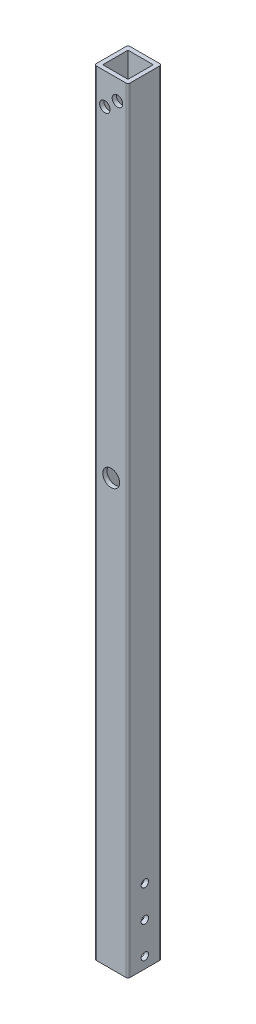
ISO-10303-21;
HEADER;
FILE_DESCRIPTION(('STEP AP214'),'2;1');
FILE_NAME('part.step','',(''),(''),'','','');
FILE_SCHEMA(('AUTOMOTIVE_DESIGN { 1 0 10303 214 1 1 1 1 }'));
ENDSEC;
DATA;
#1=APPLICATION_CONTEXT('core data for automotive mechanical design processes');
#2=APPLICATION_PROTOCOL_DEFINITION('international standard','automotive_design',2000,#1);
#3=PRODUCT_CONTEXT('',#1,'mechanical');
#4=PRODUCT('Part','Part','',(#3));
#5=PRODUCT_RELATED_PRODUCT_CATEGORY('part','',(#4));
#6=PRODUCT_DEFINITION_FORMATION('','',#4);
#7=PRODUCT_DEFINITION_CONTEXT('part definition',#1,'design');
#8=PRODUCT_DEFINITION('design','',#6,#7);
#9=PRODUCT_DEFINITION_SHAPE('','',#8);
#10=(LENGTH_UNIT() NAMED_UNIT(*) SI_UNIT(.MILLI.,.METRE.));
#11=(NAMED_UNIT(*) PLANE_ANGLE_UNIT() SI_UNIT($,.RADIAN.));
#12=(NAMED_UNIT(*) SI_UNIT($,.STERADIAN.) SOLID_ANGLE_UNIT());
#13=UNCERTAINTY_MEASURE_WITH_UNIT(LENGTH_MEASURE(1.E-05),#10,'distance_accuracy_value','');
#14=(GEOMETRIC_REPRESENTATION_CONTEXT(3) GLOBAL_UNCERTAINTY_ASSIGNED_CONTEXT((#13)) GLOBAL_UNIT_ASSIGNED_CONTEXT((#10,
#11,#12)) REPRESENTATION_CONTEXT('',''));
#15=CARTESIAN_POINT('',(0.,0.,0.));
#16=DIRECTION('',(0.,0.,1.));
#17=DIRECTION('',(1.,0.,0.));
#18=AXIS2_PLACEMENT_3D('',#15,#16,#17);
#19=CARTESIAN_POINT('',(0.,368.,0.));
#20=DIRECTION('',(0.,1.,0.));
#21=DIRECTION('',(0.,0.,1.));
#22=AXIS2_PLACEMENT_3D('',#19,#20,#21);
#23=PLANE('',#22);
#24=DIRECTION('',(1.,0.,0.));
#25=VECTOR('',#24,1.);
#26=CARTESIAN_POINT('',(-7.23809523809523,368.,11.156462585034));
#27=LINE('',#26,#25);
#28=CARTESIAN_POINT('',(-6.23809523809523,368.,11.156462585034));
#29=VERTEX_POINT('',#28);
#30=CARTESIAN_POINT('',(7.76190476190477,368.,11.156462585034));
#31=VERTEX_POINT('',#30);
#32=EDGE_CURVE('E200',#29,#31,#27,.T.);
#33=ORIENTED_EDGE('',*,*,#32,.T.);
#34=CARTESIAN_POINT('',(7.76190476190477,368.,10.156462585034));
#35=DIRECTION('',(0.,1.,0.));
#36=DIRECTION('',(0.,0.,1.));
#37=AXIS2_PLACEMENT_3D('',#34,#35,#36);
#38=CIRCLE('',#37,1.);
#39=CARTESIAN_POINT('',(8.76190476190477,368.,10.156462585034));
#40=VERTEX_POINT('',#39);
#41=EDGE_CURVE('E258',#31,#40,#38,.T.);
#42=ORIENTED_EDGE('',*,*,#41,.T.);
#43=DIRECTION('',(0.,0.,-1.));
#44=VECTOR('',#43,1.);
#45=CARTESIAN_POINT('',(8.76190476190477,368.,-4.84353741496599));
#46=LINE('',#45,#44);
#47=CARTESIAN_POINT('',(8.76190476190477,368.,-3.84353741496599));
#48=VERTEX_POINT('',#47);
#49=EDGE_CURVE('E205',#40,#48,#46,.T.);
#50=ORIENTED_EDGE('',*,*,#49,.T.);
#51=CARTESIAN_POINT('',(7.76190476190477,368.,-3.84353741496599));
#52=DIRECTION('',(0.,1.,0.));
#53=DIRECTION('',(0.,0.,1.));
#54=AXIS2_PLACEMENT_3D('',#51,#52,#53);
#55=CIRCLE('',#54,1.);
#56=CARTESIAN_POINT('',(7.76190476190477,368.,-4.84353741496599));
#57=VERTEX_POINT('',#56);
#58=EDGE_CURVE('E71',#48,#57,#55,.T.);
#59=ORIENTED_EDGE('',*,*,#58,.T.);
#60=DIRECTION('',(-1.,0.,0.));
#61=VECTOR('',#60,1.);
#62=CARTESIAN_POINT('',(-7.23809523809523,368.,-4.84353741496599));
#63=LINE('',#62,#61);
#64=CARTESIAN_POINT('',(-6.23809523809523,368.,-4.84353741496599));
#65=VERTEX_POINT('',#64);
#66=EDGE_CURVE('E208',#57,#65,#63,.T.);
#67=ORIENTED_EDGE('',*,*,#66,.T.);
#68=CARTESIAN_POINT('',(-6.23809523809523,368.,-3.84353741496599));
#69=DIRECTION('',(0.,1.,0.));
#70=DIRECTION('',(0.,0.,1.));
#71=AXIS2_PLACEMENT_3D('',#68,#69,#70);
#72=CIRCLE('',#71,1.);
#73=CARTESIAN_POINT('',(-7.23809523809523,368.,-3.84353741496599));
#74=VERTEX_POINT('',#73);
#75=EDGE_CURVE('E252',#65,#74,#72,.T.);
#76=ORIENTED_EDGE('',*,*,#75,.T.);
#77=DIRECTION('',(0.,0.,1.));
#78=VECTOR('',#77,1.);
#79=CARTESIAN_POINT('',(-7.23809523809523,368.,-4.84353741496599));
#80=LINE('',#79,#78);
#81=CARTESIAN_POINT('',(-7.23809523809523,368.,10.156462585034));
#82=VERTEX_POINT('',#81);
#83=EDGE_CURVE('E196',#74,#82,#80,.T.);
#84=ORIENTED_EDGE('',*,*,#83,.T.);
#85=CARTESIAN_POINT('',(-6.23809523809523,368.,10.156462585034));
#86=DIRECTION('',(0.,1.,0.));
#87=DIRECTION('',(0.,0.,1.));
#88=AXIS2_PLACEMENT_3D('',#85,#86,#87);
#89=CIRCLE('',#88,1.);
#90=EDGE_CURVE('E255',#82,#29,#89,.T.);
#91=ORIENTED_EDGE('',*,*,#90,.T.);
#92=EDGE_LOOP('',(#33,#42,#50,#59,#67,#76,#84,#91));
#93=FACE_BOUND('',#92,.T.);
#94=DIRECTION('',(0.,0.,1.));
#95=VECTOR('',#94,1.);
#96=CARTESIAN_POINT('',(-5.23809523809523,368.,-2.84353741496599));
#97=LINE('',#96,#95);
#98=CARTESIAN_POINT('',(-5.23809523809523,368.,-2.84353741496599));
#99=VERTEX_POINT('',#98);
#100=CARTESIAN_POINT('',(-5.23809523809523,368.,9.15646258503401));
#101=VERTEX_POINT('',#100);
#102=EDGE_CURVE('E152',#99,#101,#97,.T.);
#103=ORIENTED_EDGE('',*,*,#102,.F.);
#104=DIRECTION('',(-1.,0.,0.));
#105=VECTOR('',#104,1.);
#106=CARTESIAN_POINT('',(-5.23809523809523,368.,-2.84353741496599));
#107=LINE('',#106,#105);
#108=CARTESIAN_POINT('',(6.76190476190477,368.,-2.84353741496599));
#109=VERTEX_POINT('',#108);
#110=EDGE_CURVE('E141',#109,#99,#107,.T.);
#111=ORIENTED_EDGE('',*,*,#110,.F.);
#112=DIRECTION('',(0.,0.,-1.));
#113=VECTOR('',#112,1.);
#114=CARTESIAN_POINT('',(6.76190476190477,368.,-2.84353741496599));
#115=LINE('',#114,#113);
#116=CARTESIAN_POINT('',(6.76190476190477,368.,9.15646258503401));
#117=VERTEX_POINT('',#116);
#118=EDGE_CURVE('E170',#117,#109,#115,.T.);
#119=ORIENTED_EDGE('',*,*,#118,.F.);
#120=DIRECTION('',(1.,0.,0.));
#121=VECTOR('',#120,1.);
#122=CARTESIAN_POINT('',(-5.23809523809523,368.,9.15646258503401));
#123=LINE('',#122,#121);
#124=EDGE_CURVE('E166',#101,#117,#123,.T.);
#125=ORIENTED_EDGE('',*,*,#124,.F.);
#126=EDGE_LOOP('',(#103,#111,#119,#125));
#127=FACE_BOUND('',#126,.T.);
#128=ADVANCED_FACE('F48',(#93,#127),#23,.T.);
#129=CARTESIAN_POINT('',(0.,0.,0.));
#130=DIRECTION('',(0.,1.,0.));
#131=DIRECTION('',(0.,0.,1.));
#132=AXIS2_PLACEMENT_3D('',#129,#130,#131);
#133=PLANE('',#132);
#134=DIRECTION('',(0.,0.,-1.));
#135=VECTOR('',#134,1.);
#136=CARTESIAN_POINT('',(8.76190476190477,0.,-4.84353741496599));
#137=LINE('',#136,#135);
#138=CARTESIAN_POINT('',(8.76190476190477,0.,10.156462585034));
#139=VERTEX_POINT('',#138);
#140=CARTESIAN_POINT('',(8.76190476190477,0.,-3.84353741496599));
#141=VERTEX_POINT('',#140);
#142=EDGE_CURVE('E219',#139,#141,#137,.T.);
#143=ORIENTED_EDGE('',*,*,#142,.F.);
#144=CARTESIAN_POINT('',(7.76190476190477,0.,10.156462585034));
#145=DIRECTION('',(0.,1.,0.));
#146=DIRECTION('',(0.,0.,1.));
#147=AXIS2_PLACEMENT_3D('',#144,#145,#146);
#148=CIRCLE('',#147,1.);
#149=CARTESIAN_POINT('',(7.76190476190477,0.,11.156462585034));
#150=VERTEX_POINT('',#149);
#151=EDGE_CURVE('E240',#139,#150,#148,.F.);
#152=ORIENTED_EDGE('',*,*,#151,.T.);
#153=DIRECTION('',(1.,0.,0.));
#154=VECTOR('',#153,1.);
#155=CARTESIAN_POINT('',(-7.23809523809523,0.,11.156462585034));
#156=LINE('',#155,#154);
#157=CARTESIAN_POINT('',(-6.23809523809523,0.,11.156462585034));
#158=VERTEX_POINT('',#157);
#159=EDGE_CURVE('E215',#158,#150,#156,.T.);
#160=ORIENTED_EDGE('',*,*,#159,.F.);
#161=CARTESIAN_POINT('',(-6.23809523809523,0.,10.156462585034));
#162=DIRECTION('',(0.,1.,0.));
#163=DIRECTION('',(0.,0.,1.));
#164=AXIS2_PLACEMENT_3D('',#161,#162,#163);
#165=CIRCLE('',#164,1.);
#166=CARTESIAN_POINT('',(-7.23809523809523,0.,10.156462585034));
#167=VERTEX_POINT('',#166);
#168=EDGE_CURVE('E237',#158,#167,#165,.F.);
#169=ORIENTED_EDGE('',*,*,#168,.T.);
#170=DIRECTION('',(0.,0.,1.));
#171=VECTOR('',#170,1.);
#172=CARTESIAN_POINT('',(-7.23809523809523,0.,-4.84353741496599));
#173=LINE('',#172,#171);
#174=CARTESIAN_POINT('',(-7.23809523809523,0.,-3.84353741496599));
#175=VERTEX_POINT('',#174);
#176=EDGE_CURVE('E161',#175,#167,#173,.T.);
#177=ORIENTED_EDGE('',*,*,#176,.F.);
#178=CARTESIAN_POINT('',(-6.23809523809523,0.,-3.84353741496599));
#179=DIRECTION('',(0.,1.,0.));
#180=DIRECTION('',(0.,0.,1.));
#181=AXIS2_PLACEMENT_3D('',#178,#179,#180);
#182=CIRCLE('',#181,1.);
#183=CARTESIAN_POINT('',(-6.23809523809523,0.,-4.84353741496599));
#184=VERTEX_POINT('',#183);
#185=EDGE_CURVE('E234',#175,#184,#182,.F.);
#186=ORIENTED_EDGE('',*,*,#185,.T.);
#187=DIRECTION('',(-1.,0.,0.));
#188=VECTOR('',#187,1.);
#189=CARTESIAN_POINT('',(-7.23809523809523,0.,-4.84353741496599));
#190=LINE('',#189,#188);
#191=CARTESIAN_POINT('',(7.76190476190477,0.,-4.84353741496599));
#192=VERTEX_POINT('',#191);
#193=EDGE_CURVE('E201',#192,#184,#190,.T.);
#194=ORIENTED_EDGE('',*,*,#193,.F.);
#195=CARTESIAN_POINT('',(7.76190476190477,0.,-3.84353741496599));
#196=DIRECTION('',(0.,1.,0.));
#197=DIRECTION('',(0.,0.,1.));
#198=AXIS2_PLACEMENT_3D('',#195,#196,#197);
#199=CIRCLE('',#198,1.);
#200=EDGE_CURVE('E231',#192,#141,#199,.F.);
#201=ORIENTED_EDGE('',*,*,#200,.T.);
#202=EDGE_LOOP('',(#143,#152,#160,#169,#177,#186,#194,#201));
#203=FACE_BOUND('',#202,.T.);
#204=DIRECTION('',(-1.,0.,0.));
#205=VECTOR('',#204,1.);
#206=CARTESIAN_POINT('',(-5.23809523809523,0.,-2.84353741496599));
#207=LINE('',#206,#205);
#208=CARTESIAN_POINT('',(6.76190476190477,0.,-2.84353741496599));
#209=VERTEX_POINT('',#208);
#210=CARTESIAN_POINT('',(-5.23809523809523,0.,-2.84353741496599));
#211=VERTEX_POINT('',#210);
#212=EDGE_CURVE('E176',#209,#211,#207,.T.);
#213=ORIENTED_EDGE('',*,*,#212,.T.);
#214=DIRECTION('',(0.,0.,1.));
#215=VECTOR('',#214,1.);
#216=CARTESIAN_POINT('',(-5.23809523809523,0.,-2.84353741496599));
#217=LINE('',#216,#215);
#218=CARTESIAN_POINT('',(-5.23809523809523,0.,9.15646258503401));
#219=VERTEX_POINT('',#218);
#220=EDGE_CURVE('E159',#211,#219,#217,.T.);
#221=ORIENTED_EDGE('',*,*,#220,.T.);
#222=DIRECTION('',(1.,0.,0.));
#223=VECTOR('',#222,1.);
#224=CARTESIAN_POINT('',(-5.23809523809523,0.,9.15646258503401));
#225=LINE('',#224,#223);
#226=CARTESIAN_POINT('',(6.76190476190477,0.,9.15646258503401));
#227=VERTEX_POINT('',#226);
#228=EDGE_CURVE('E182',#219,#227,#225,.T.);
#229=ORIENTED_EDGE('',*,*,#228,.T.);
#230=DIRECTION('',(0.,0.,-1.));
#231=VECTOR('',#230,1.);
#232=CARTESIAN_POINT('',(6.76190476190477,0.,-2.84353741496599));
#233=LINE('',#232,#231);
#234=EDGE_CURVE('E153',#227,#209,#233,.T.);
#235=ORIENTED_EDGE('',*,*,#234,.T.);
#236=EDGE_LOOP('',(#213,#221,#229,#235));
#237=FACE_BOUND('',#236,.T.);
#238=ADVANCED_FACE('F389',(#203,#237),#133,.F.);
#239=CARTESIAN_POINT('',(-7.23809523809523,368.,-4.84353741496599));
#240=DIRECTION('',(1.,0.,0.));
#241=DIRECTION('',(0.,0.,-1.));
#242=AXIS2_PLACEMENT_3D('',#239,#240,#241);
#243=PLANE('',#242);
#244=CARTESIAN_POINT('',(-7.23809523809523,5.25,3.15646258503401));
#245=DIRECTION('',(-1.,0.,0.));
#246=DIRECTION('',(0.,0.,1.));
#247=AXIS2_PLACEMENT_3D('',#244,#245,#246);
#248=CIRCLE('',#247,1.75);
#249=CARTESIAN_POINT('',(-7.23809523809523,5.25,4.90646258503401));
#250=VERTEX_POINT('',#249);
#251=EDGE_CURVE('E337',#250,#250,#248,.T.);
#252=ORIENTED_EDGE('',*,*,#251,.F.);
#253=EDGE_LOOP('',(#252));
#254=FACE_BOUND('',#253,.T.);
#255=CARTESIAN_POINT('',(-7.23809523809523,20.25,3.15646258503401));
#256=DIRECTION('',(-1.,0.,0.));
#257=DIRECTION('',(0.,0.,1.));
#258=AXIS2_PLACEMENT_3D('',#255,#256,#257);
#259=CIRCLE('',#258,1.75);
#260=CARTESIAN_POINT('',(-7.23809523809523,20.25,4.90646258503401));
#261=VERTEX_POINT('',#260);
#262=EDGE_CURVE('E341',#261,#261,#259,.T.);
#263=ORIENTED_EDGE('',*,*,#262,.F.);
#264=EDGE_LOOP('',(#263));
#265=FACE_BOUND('',#264,.T.);
#266=CARTESIAN_POINT('',(-7.23809523809523,35.25,3.15646258503401));
#267=DIRECTION('',(-1.,0.,0.));
#268=DIRECTION('',(0.,0.,1.));
#269=AXIS2_PLACEMENT_3D('',#266,#267,#268);
#270=CIRCLE('',#269,1.75);
#271=CARTESIAN_POINT('',(-7.23809523809523,35.25,4.90646258503401));
#272=VERTEX_POINT('',#271);
#273=EDGE_CURVE('E349',#272,#272,#270,.T.);
#274=ORIENTED_EDGE('',*,*,#273,.F.);
#275=EDGE_LOOP('',(#274));
#276=FACE_BOUND('',#275,.T.);
#277=ORIENTED_EDGE('',*,*,#176,.T.);
#278=DIRECTION('',(0.,-1.,0.));
#279=VECTOR('',#278,1.);
#280=CARTESIAN_POINT('',(-7.23809523809523,368.,10.156462585034));
#281=LINE('',#280,#279);
#282=EDGE_CURVE('E265',#167,#82,#281,.F.);
#283=ORIENTED_EDGE('',*,*,#282,.T.);
#284=ORIENTED_EDGE('',*,*,#83,.F.);
#285=DIRECTION('',(0.,-1.,0.));
#286=VECTOR('',#285,1.);
#287=CARTESIAN_POINT('',(-7.23809523809523,368.,-3.84353741496599));
#288=LINE('',#287,#286);
#289=EDGE_CURVE('E261',#74,#175,#288,.T.);
#290=ORIENTED_EDGE('',*,*,#289,.T.);
#291=EDGE_LOOP('',(#277,#283,#284,#290));
#292=FACE_BOUND('',#291,.T.);
#293=ADVANCED_FACE('F385',(#254,#265,#276,#292),#243,.F.);
#294=CARTESIAN_POINT('',(-7.23809523809523,368.,11.156462585034));
#295=DIRECTION('',(0.,0.,-1.));
#296=DIRECTION('',(-1.,0.,0.));
#297=AXIS2_PLACEMENT_3D('',#294,#295,#296);
#298=PLANE('',#297);
#299=CARTESIAN_POINT('',(-2.23222636396435,353.252670669956,11.156462585034));
#300=DIRECTION('',(0.,0.,1.));
#301=DIRECTION('',(1.,0.,0.));
#302=AXIS2_PLACEMENT_3D('',#299,#300,#301);
#303=CIRCLE('',#302,2.5);
#304=CARTESIAN_POINT('',(0.267773636035649,353.252670669956,11.156462585034));
#305=VERTEX_POINT('',#304);
#306=EDGE_CURVE('E295',#305,#305,#303,.T.);
#307=ORIENTED_EDGE('',*,*,#306,.F.);
#308=EDGE_LOOP('',(#307));
#309=FACE_BOUND('',#308,.T.);
#310=CARTESIAN_POINT('',(3.75386496534022,358.559902584733,11.156462585034));
#311=DIRECTION('',(0.,0.,1.));
#312=DIRECTION('',(1.,0.,0.));
#313=AXIS2_PLACEMENT_3D('',#310,#311,#312);
#314=CIRCLE('',#313,2.5);
#315=CARTESIAN_POINT('',(6.25386496534022,358.559902584733,11.156462585034));
#316=VERTEX_POINT('',#315);
#317=EDGE_CURVE('E304',#316,#316,#314,.T.);
#318=ORIENTED_EDGE('',*,*,#317,.F.);
#319=EDGE_LOOP('',(#318));
#320=FACE_BOUND('',#319,.T.);
#321=CARTESIAN_POINT('',(0.761904761904771,202.,11.156462585034));
#322=DIRECTION('',(0.,0.,-1.));
#323=DIRECTION('',(-1.,0.,0.));
#324=AXIS2_PLACEMENT_3D('',#321,#322,#323);
#325=CIRCLE('',#324,4.);
#326=CARTESIAN_POINT('',(-3.23809523809523,202.,11.156462585034));
#327=VERTEX_POINT('',#326);
#328=EDGE_CURVE('E290',#327,#327,#325,.T.);
#329=ORIENTED_EDGE('',*,*,#328,.T.);
#330=EDGE_LOOP('',(#329));
#331=FACE_BOUND('',#330,.T.);
#332=ORIENTED_EDGE('',*,*,#159,.T.);
#333=DIRECTION('',(0.,-1.,0.));
#334=VECTOR('',#333,1.);
#335=CARTESIAN_POINT('',(7.76190476190477,368.,11.156462585034));
#336=LINE('',#335,#334);
#337=EDGE_CURVE('E247',#150,#31,#336,.F.);
#338=ORIENTED_EDGE('',*,*,#337,.T.);
#339=ORIENTED_EDGE('',*,*,#32,.F.);
#340=DIRECTION('',(0.,-1.,0.));
#341=VECTOR('',#340,1.);
#342=CARTESIAN_POINT('',(-6.23809523809523,368.,11.156462585034));
#343=LINE('',#342,#341);
#344=EDGE_CURVE('E243',#29,#158,#343,.T.);
#345=ORIENTED_EDGE('',*,*,#344,.T.);
#346=EDGE_LOOP('',(#332,#338,#339,#345));
#347=FACE_BOUND('',#346,.T.);
#348=ADVANCED_FACE('F388',(#309,#320,#331,#347),#298,.F.);
#349=CARTESIAN_POINT('',(8.76190476190477,368.,-4.84353741496599));
#350=DIRECTION('',(-1.,0.,0.));
#351=DIRECTION('',(0.,0.,1.));
#352=AXIS2_PLACEMENT_3D('',#349,#350,#351);
#353=PLANE('',#352);
#354=CARTESIAN_POINT('',(8.76190476190477,5.25,3.15646258503401));
#355=DIRECTION('',(-1.,0.,0.));
#356=DIRECTION('',(0.,0.,1.));
#357=AXIS2_PLACEMENT_3D('',#354,#355,#356);
#358=CIRCLE('',#357,1.75);
#359=CARTESIAN_POINT('',(8.76190476190477,5.25,4.90646258503401));
#360=VERTEX_POINT('',#359);
#361=EDGE_CURVE('E276',#360,#360,#358,.T.);
#362=ORIENTED_EDGE('',*,*,#361,.T.);
#363=EDGE_LOOP('',(#362));
#364=FACE_BOUND('',#363,.T.);
#365=CARTESIAN_POINT('',(8.76190476190477,20.25,3.15646258503401));
#366=DIRECTION('',(-1.,0.,0.));
#367=DIRECTION('',(0.,0.,1.));
#368=AXIS2_PLACEMENT_3D('',#365,#366,#367);
#369=CIRCLE('',#368,1.75);
#370=CARTESIAN_POINT('',(8.76190476190477,20.25,4.90646258503401));
#371=VERTEX_POINT('',#370);
#372=EDGE_CURVE('E345',#371,#371,#369,.T.);
#373=ORIENTED_EDGE('',*,*,#372,.T.);
#374=EDGE_LOOP('',(#373));
#375=FACE_BOUND('',#374,.T.);
#376=CARTESIAN_POINT('',(8.76190476190477,35.25,3.15646258503401));
#377=DIRECTION('',(-1.,0.,0.));
#378=DIRECTION('',(0.,0.,1.));
#379=AXIS2_PLACEMENT_3D('',#376,#377,#378);
#380=CIRCLE('',#379,1.75);
#381=CARTESIAN_POINT('',(8.76190476190477,35.25,4.90646258503401));
#382=VERTEX_POINT('',#381);
#383=EDGE_CURVE('E333',#382,#382,#380,.T.);
#384=ORIENTED_EDGE('',*,*,#383,.T.);
#385=EDGE_LOOP('',(#384));
#386=FACE_BOUND('',#385,.T.);
#387=ORIENTED_EDGE('',*,*,#49,.F.);
#388=DIRECTION('',(0.,-1.,0.));
#389=VECTOR('',#388,1.);
#390=CARTESIAN_POINT('',(8.76190476190477,368.,10.156462585034));
#391=LINE('',#390,#389);
#392=EDGE_CURVE('E227',#40,#139,#391,.T.);
#393=ORIENTED_EDGE('',*,*,#392,.T.);
#394=ORIENTED_EDGE('',*,*,#142,.T.);
#395=DIRECTION('',(0.,-1.,0.));
#396=VECTOR('',#395,1.);
#397=CARTESIAN_POINT('',(8.76190476190477,368.,-3.84353741496599));
#398=LINE('',#397,#396);
#399=EDGE_CURVE('E211',#141,#48,#398,.F.);
#400=ORIENTED_EDGE('',*,*,#399,.T.);
#401=EDGE_LOOP('',(#387,#393,#394,#400));
#402=FACE_BOUND('',#401,.T.);
#403=ADVANCED_FACE('F411',(#364,#375,#386,#402),#353,.F.);
#404=CARTESIAN_POINT('',(-7.23809523809523,368.,-4.84353741496599));
#405=DIRECTION('',(0.,0.,1.));
#406=DIRECTION('',(1.,0.,0.));
#407=AXIS2_PLACEMENT_3D('',#404,#405,#406);
#408=PLANE('',#407);
#409=CARTESIAN_POINT('',(-2.23222636396435,353.252670669956,-4.84353741496599));
#410=DIRECTION('',(0.,0.,1.));
#411=DIRECTION('',(1.,0.,0.));
#412=AXIS2_PLACEMENT_3D('',#409,#410,#411);
#413=CIRCLE('',#412,2.5);
#414=CARTESIAN_POINT('',(0.267773636035649,353.252670669956,-4.84353741496599));
#415=VERTEX_POINT('',#414);
#416=EDGE_CURVE('E319',#415,#415,#413,.T.);
#417=ORIENTED_EDGE('',*,*,#416,.T.);
#418=EDGE_LOOP('',(#417));
#419=FACE_BOUND('',#418,.T.);
#420=CARTESIAN_POINT('',(3.75386496534022,358.559902584733,-4.84353741496599));
#421=DIRECTION('',(0.,0.,1.));
#422=DIRECTION('',(1.,0.,0.));
#423=AXIS2_PLACEMENT_3D('',#420,#421,#422);
#424=CIRCLE('',#423,2.5);
#425=CARTESIAN_POINT('',(6.25386496534022,358.559902584733,-4.84353741496599));
#426=VERTEX_POINT('',#425);
#427=EDGE_CURVE('E301',#426,#426,#424,.T.);
#428=ORIENTED_EDGE('',*,*,#427,.T.);
#429=EDGE_LOOP('',(#428));
#430=FACE_BOUND('',#429,.T.);
#431=CARTESIAN_POINT('',(0.761904761904771,202.,-4.84353741496599));
#432=DIRECTION('',(0.,0.,-1.));
#433=DIRECTION('',(-1.,0.,0.));
#434=AXIS2_PLACEMENT_3D('',#431,#432,#433);
#435=CIRCLE('',#434,4.);
#436=CARTESIAN_POINT('',(-3.23809523809523,202.,-4.84353741496599));
#437=VERTEX_POINT('',#436);
#438=EDGE_CURVE('E323',#437,#437,#435,.T.);
#439=ORIENTED_EDGE('',*,*,#438,.F.);
#440=EDGE_LOOP('',(#439));
#441=FACE_BOUND('',#440,.T.);
#442=ORIENTED_EDGE('',*,*,#193,.T.);
#443=DIRECTION('',(0.,-1.,0.));
#444=VECTOR('',#443,1.);
#445=CARTESIAN_POINT('',(-6.23809523809523,368.,-4.84353741496599));
#446=LINE('',#445,#444);
#447=EDGE_CURVE('E11',#184,#65,#446,.F.);
#448=ORIENTED_EDGE('',*,*,#447,.T.);
#449=ORIENTED_EDGE('',*,*,#66,.F.);
#450=DIRECTION('',(0.,-1.,0.));
#451=VECTOR('',#450,1.);
#452=CARTESIAN_POINT('',(7.76190476190477,368.,-4.84353741496599));
#453=LINE('',#452,#451);
#454=EDGE_CURVE('E58',#57,#192,#453,.T.);
#455=ORIENTED_EDGE('',*,*,#454,.T.);
#456=EDGE_LOOP('',(#442,#448,#449,#455));
#457=FACE_BOUND('',#456,.T.);
#458=ADVANCED_FACE('F417',(#419,#430,#441,#457),#408,.F.);
#459=CARTESIAN_POINT('',(-5.23809523809523,368.,-2.84353741496599));
#460=DIRECTION('',(0.,0.,1.));
#461=DIRECTION('',(1.,0.,0.));
#462=AXIS2_PLACEMENT_3D('',#459,#460,#461);
#463=PLANE('',#462);
#464=CARTESIAN_POINT('',(-2.23222636396435,353.252670669956,-2.84353741496599));
#465=DIRECTION('',(0.,0.,1.));
#466=DIRECTION('',(1.,0.,0.));
#467=AXIS2_PLACEMENT_3D('',#464,#465,#466);
#468=CIRCLE('',#467,2.5);
#469=CARTESIAN_POINT('',(0.267773636035649,353.252670669956,-2.84353741496599));
#470=VERTEX_POINT('',#469);
#471=EDGE_CURVE('E315',#470,#470,#468,.T.);
#472=ORIENTED_EDGE('',*,*,#471,.F.);
#473=EDGE_LOOP('',(#472));
#474=FACE_BOUND('',#473,.T.);
#475=CARTESIAN_POINT('',(3.75386496534022,358.559902584733,-2.84353741496599));
#476=DIRECTION('',(0.,0.,1.));
#477=DIRECTION('',(1.,0.,0.));
#478=AXIS2_PLACEMENT_3D('',#475,#476,#477);
#479=CIRCLE('',#478,2.5);
#480=CARTESIAN_POINT('',(6.25386496534022,358.559902584733,-2.84353741496599));
#481=VERTEX_POINT('',#480);
#482=EDGE_CURVE('E294',#481,#481,#479,.T.);
#483=ORIENTED_EDGE('',*,*,#482,.F.);
#484=EDGE_LOOP('',(#483));
#485=FACE_BOUND('',#484,.T.);
#486=CARTESIAN_POINT('',(0.761904761904771,202.,-2.84353741496599));
#487=DIRECTION('',(0.,0.,1.));
#488=DIRECTION('',(1.,0.,0.));
#489=AXIS2_PLACEMENT_3D('',#486,#487,#488);
#490=CIRCLE('',#489,4.);
#491=CARTESIAN_POINT('',(4.76190476190477,202.,-2.84353741496599));
#492=VERTEX_POINT('',#491);
#493=EDGE_CURVE('E289',#492,#492,#490,.T.);
#494=ORIENTED_EDGE('',*,*,#493,.F.);
#495=EDGE_LOOP('',(#494));
#496=FACE_BOUND('',#495,.T.);
#497=ORIENTED_EDGE('',*,*,#212,.F.);
#498=DIRECTION('',(0.,-1.,0.));
#499=VECTOR('',#498,1.);
#500=CARTESIAN_POINT('',(6.76190476190477,368.,-2.84353741496599));
#501=LINE('',#500,#499);
#502=EDGE_CURVE('E147',#109,#209,#501,.T.);
#503=ORIENTED_EDGE('',*,*,#502,.F.);
#504=ORIENTED_EDGE('',*,*,#110,.T.);
#505=DIRECTION('',(0.,-1.,0.));
#506=VECTOR('',#505,1.);
#507=CARTESIAN_POINT('',(-5.23809523809523,368.,-2.84353741496599));
#508=LINE('',#507,#506);
#509=EDGE_CURVE('E144',#99,#211,#508,.T.);
#510=ORIENTED_EDGE('',*,*,#509,.T.);
#511=EDGE_LOOP('',(#497,#503,#504,#510));
#512=FACE_BOUND('',#511,.T.);
#513=ADVANCED_FACE('F143',(#474,#485,#496,#512),#463,.T.);
#514=CARTESIAN_POINT('',(-5.23809523809523,368.,-2.84353741496599));
#515=DIRECTION('',(1.,0.,0.));
#516=DIRECTION('',(0.,0.,-1.));
#517=AXIS2_PLACEMENT_3D('',#514,#515,#516);
#518=PLANE('',#517);
#519=CARTESIAN_POINT('',(-5.23809523809523,5.25,3.15646258503401));
#520=DIRECTION('',(1.,0.,0.));
#521=DIRECTION('',(0.,0.,-1.));
#522=AXIS2_PLACEMENT_3D('',#519,#520,#521);
#523=CIRCLE('',#522,1.75);
#524=CARTESIAN_POINT('',(-5.23809523809523,5.25,1.40646258503401));
#525=VERTEX_POINT('',#524);
#526=EDGE_CURVE('E179',#525,#525,#523,.T.);
#527=ORIENTED_EDGE('',*,*,#526,.F.);
#528=EDGE_LOOP('',(#527));
#529=FACE_BOUND('',#528,.T.);
#530=CARTESIAN_POINT('',(-5.23809523809523,20.25,3.15646258503401));
#531=DIRECTION('',(1.,0.,0.));
#532=DIRECTION('',(0.,0.,-1.));
#533=AXIS2_PLACEMENT_3D('',#530,#531,#532);
#534=CIRCLE('',#533,1.75);
#535=CARTESIAN_POINT('',(-5.23809523809523,20.25,1.40646258503401));
#536=VERTEX_POINT('',#535);
#537=EDGE_CURVE('E281',#536,#536,#534,.T.);
#538=ORIENTED_EDGE('',*,*,#537,.F.);
#539=EDGE_LOOP('',(#538));
#540=FACE_BOUND('',#539,.T.);
#541=CARTESIAN_POINT('',(-5.23809523809523,35.25,3.15646258503401));
#542=DIRECTION('',(1.,0.,0.));
#543=DIRECTION('',(0.,0.,-1.));
#544=AXIS2_PLACEMENT_3D('',#541,#542,#543);
#545=CIRCLE('',#544,1.75);
#546=CARTESIAN_POINT('',(-5.23809523809523,35.25,1.40646258503401));
#547=VERTEX_POINT('',#546);
#548=EDGE_CURVE('E275',#547,#547,#545,.T.);
#549=ORIENTED_EDGE('',*,*,#548,.F.);
#550=EDGE_LOOP('',(#549));
#551=FACE_BOUND('',#550,.T.);
#552=ORIENTED_EDGE('',*,*,#220,.F.);
#553=ORIENTED_EDGE('',*,*,#509,.F.);
#554=ORIENTED_EDGE('',*,*,#102,.T.);
#555=DIRECTION('',(0.,-1.,0.));
#556=VECTOR('',#555,1.);
#557=CARTESIAN_POINT('',(-5.23809523809523,368.,9.15646258503401));
#558=LINE('',#557,#556);
#559=EDGE_CURVE('E162',#101,#219,#558,.T.);
#560=ORIENTED_EDGE('',*,*,#559,.T.);
#561=EDGE_LOOP('',(#552,#553,#554,#560));
#562=FACE_BOUND('',#561,.T.);
#563=ADVANCED_FACE('F156',(#529,#540,#551,#562),#518,.T.);
#564=CARTESIAN_POINT('',(-5.23809523809523,368.,9.15646258503401));
#565=DIRECTION('',(0.,0.,-1.));
#566=DIRECTION('',(-1.,0.,0.));
#567=AXIS2_PLACEMENT_3D('',#564,#565,#566);
#568=PLANE('',#567);
#569=CARTESIAN_POINT('',(-2.23222636396435,353.252670669956,9.15646258503401));
#570=DIRECTION('',(0.,0.,-1.));
#571=DIRECTION('',(-1.,0.,0.));
#572=AXIS2_PLACEMENT_3D('',#569,#570,#571);
#573=CIRCLE('',#572,2.5);
#574=CARTESIAN_POINT('',(-4.73222636396435,353.252670669956,9.15646258503401));
#575=VERTEX_POINT('',#574);
#576=EDGE_CURVE('E52',#575,#575,#573,.T.);
#577=ORIENTED_EDGE('',*,*,#576,.F.);
#578=EDGE_LOOP('',(#577));
#579=FACE_BOUND('',#578,.T.);
#580=CARTESIAN_POINT('',(3.75386496534022,358.559902584733,9.15646258503401));
#581=DIRECTION('',(0.,0.,-1.));
#582=DIRECTION('',(-1.,0.,0.));
#583=AXIS2_PLACEMENT_3D('',#580,#581,#582);
#584=CIRCLE('',#583,2.5);
#585=CARTESIAN_POINT('',(1.25386496534021,358.559902584733,9.15646258503401));
#586=VERTEX_POINT('',#585);
#587=EDGE_CURVE('E291',#586,#586,#584,.T.);
#588=ORIENTED_EDGE('',*,*,#587,.F.);
#589=EDGE_LOOP('',(#588));
#590=FACE_BOUND('',#589,.T.);
#591=CARTESIAN_POINT('',(0.761904761904771,202.,9.15646258503401));
#592=DIRECTION('',(0.,0.,-1.));
#593=DIRECTION('',(-1.,0.,0.));
#594=AXIS2_PLACEMENT_3D('',#591,#592,#593);
#595=CIRCLE('',#594,4.);
#596=CARTESIAN_POINT('',(-3.23809523809523,202.,9.15646258503401));
#597=VERTEX_POINT('',#596);
#598=EDGE_CURVE('E286',#597,#597,#595,.T.);
#599=ORIENTED_EDGE('',*,*,#598,.F.);
#600=EDGE_LOOP('',(#599));
#601=FACE_BOUND('',#600,.T.);
#602=ORIENTED_EDGE('',*,*,#228,.F.);
#603=ORIENTED_EDGE('',*,*,#559,.F.);
#604=ORIENTED_EDGE('',*,*,#124,.T.);
#605=DIRECTION('',(0.,-1.,0.));
#606=VECTOR('',#605,1.);
#607=CARTESIAN_POINT('',(6.76190476190477,368.,9.15646258503401));
#608=LINE('',#607,#606);
#609=EDGE_CURVE('E191',#117,#227,#608,.T.);
#610=ORIENTED_EDGE('',*,*,#609,.T.);
#611=EDGE_LOOP('',(#602,#603,#604,#610));
#612=FACE_BOUND('',#611,.T.);
#613=ADVANCED_FACE('F370',(#579,#590,#601,#612),#568,.T.);
#614=CARTESIAN_POINT('',(6.76190476190477,368.,-2.84353741496599));
#615=DIRECTION('',(-1.,0.,0.));
#616=DIRECTION('',(0.,0.,1.));
#617=AXIS2_PLACEMENT_3D('',#614,#615,#616);
#618=PLANE('',#617);
#619=CARTESIAN_POINT('',(6.76190476190477,5.25,3.15646258503401));
#620=DIRECTION('',(-1.,0.,0.));
#621=DIRECTION('',(0.,0.,1.));
#622=AXIS2_PLACEMENT_3D('',#619,#620,#621);
#623=CIRCLE('',#622,1.75);
#624=CARTESIAN_POINT('',(6.76190476190477,5.25,4.90646258503401));
#625=VERTEX_POINT('',#624);
#626=EDGE_CURVE('E282',#625,#625,#623,.T.);
#627=ORIENTED_EDGE('',*,*,#626,.F.);
#628=EDGE_LOOP('',(#627));
#629=FACE_BOUND('',#628,.T.);
#630=CARTESIAN_POINT('',(6.76190476190477,20.25,3.15646258503401));
#631=DIRECTION('',(-1.,0.,0.));
#632=DIRECTION('',(0.,0.,1.));
#633=AXIS2_PLACEMENT_3D('',#630,#631,#632);
#634=CIRCLE('',#633,1.75);
#635=CARTESIAN_POINT('',(6.76190476190477,20.25,4.90646258503401));
#636=VERTEX_POINT('',#635);
#637=EDGE_CURVE('E277',#636,#636,#634,.T.);
#638=ORIENTED_EDGE('',*,*,#637,.F.);
#639=EDGE_LOOP('',(#638));
#640=FACE_BOUND('',#639,.T.);
#641=CARTESIAN_POINT('',(6.76190476190477,35.25,3.15646258503401));
#642=DIRECTION('',(-1.,0.,0.));
#643=DIRECTION('',(0.,0.,1.));
#644=AXIS2_PLACEMENT_3D('',#641,#642,#643);
#645=CIRCLE('',#644,1.75);
#646=CARTESIAN_POINT('',(6.76190476190477,35.25,4.90646258503401));
#647=VERTEX_POINT('',#646);
#648=EDGE_CURVE('E271',#647,#647,#645,.T.);
#649=ORIENTED_EDGE('',*,*,#648,.F.);
#650=EDGE_LOOP('',(#649));
#651=FACE_BOUND('',#650,.T.);
#652=ORIENTED_EDGE('',*,*,#234,.F.);
#653=ORIENTED_EDGE('',*,*,#609,.F.);
#654=ORIENTED_EDGE('',*,*,#118,.T.);
#655=ORIENTED_EDGE('',*,*,#502,.T.);
#656=EDGE_LOOP('',(#652,#653,#654,#655));
#657=FACE_BOUND('',#656,.T.);
#658=ADVANCED_FACE('F446',(#629,#640,#651,#657),#618,.T.);
#659=CARTESIAN_POINT('',(7.76190476190477,368.,10.156462585034));
#660=DIRECTION('',(0.,-1.,0.));
#661=DIRECTION('',(0.,0.,-1.));
#662=AXIS2_PLACEMENT_3D('',#659,#660,#661);
#663=CYLINDRICAL_SURFACE('',#662,1.);
#664=ORIENTED_EDGE('',*,*,#41,.F.);
#665=ORIENTED_EDGE('',*,*,#337,.F.);
#666=ORIENTED_EDGE('',*,*,#151,.F.);
#667=ORIENTED_EDGE('',*,*,#392,.F.);
#668=EDGE_LOOP('',(#664,#665,#666,#667));
#669=FACE_BOUND('',#668,.T.);
#670=ADVANCED_FACE('F407',(#669),#663,.T.);
#671=CARTESIAN_POINT('',(-6.23809523809523,368.,10.156462585034));
#672=DIRECTION('',(0.,-1.,0.));
#673=DIRECTION('',(0.,0.,-1.));
#674=AXIS2_PLACEMENT_3D('',#671,#672,#673);
#675=CYLINDRICAL_SURFACE('',#674,1.);
#676=ORIENTED_EDGE('',*,*,#90,.F.);
#677=ORIENTED_EDGE('',*,*,#282,.F.);
#678=ORIENTED_EDGE('',*,*,#168,.F.);
#679=ORIENTED_EDGE('',*,*,#344,.F.);
#680=EDGE_LOOP('',(#676,#677,#678,#679));
#681=FACE_BOUND('',#680,.T.);
#682=ADVANCED_FACE('F399',(#681),#675,.T.);
#683=CARTESIAN_POINT('',(-6.23809523809523,368.,-3.84353741496599));
#684=DIRECTION('',(0.,-1.,0.));
#685=DIRECTION('',(0.,0.,-1.));
#686=AXIS2_PLACEMENT_3D('',#683,#684,#685);
#687=CYLINDRICAL_SURFACE('',#686,1.);
#688=ORIENTED_EDGE('',*,*,#75,.F.);
#689=ORIENTED_EDGE('',*,*,#447,.F.);
#690=ORIENTED_EDGE('',*,*,#185,.F.);
#691=ORIENTED_EDGE('',*,*,#289,.F.);
#692=EDGE_LOOP('',(#688,#689,#690,#691));
#693=FACE_BOUND('',#692,.T.);
#694=ADVANCED_FACE('F421',(#693),#687,.T.);
#695=CARTESIAN_POINT('',(7.76190476190477,368.,-3.84353741496599));
#696=DIRECTION('',(0.,-1.,0.));
#697=DIRECTION('',(0.,0.,-1.));
#698=AXIS2_PLACEMENT_3D('',#695,#696,#697);
#699=CYLINDRICAL_SURFACE('',#698,1.);
#700=ORIENTED_EDGE('',*,*,#58,.F.);
#701=ORIENTED_EDGE('',*,*,#399,.F.);
#702=ORIENTED_EDGE('',*,*,#200,.F.);
#703=ORIENTED_EDGE('',*,*,#454,.F.);
#704=EDGE_LOOP('',(#700,#701,#702,#703));
#705=FACE_BOUND('',#704,.T.);
#706=ADVANCED_FACE('F50',(#705),#699,.T.);
#707=CARTESIAN_POINT('',(8.76190476190477,35.25,3.15646258503401));
#708=DIRECTION('',(-1.,0.,0.));
#709=DIRECTION('',(0.,0.,1.));
#710=AXIS2_PLACEMENT_3D('',#707,#708,#709);
#711=CYLINDRICAL_SURFACE('',#710,1.75);
#712=ORIENTED_EDGE('',*,*,#648,.T.);
#713=EDGE_LOOP('',(#712));
#714=FACE_BOUND('',#713,.T.);
#715=ORIENTED_EDGE('',*,*,#383,.F.);
#716=EDGE_LOOP('',(#715));
#717=FACE_BOUND('',#716,.T.);
#718=ADVANCED_FACE('F382',(#714,#717),#711,.F.);
#719=CARTESIAN_POINT('',(8.76190476190477,20.25,3.15646258503401));
#720=DIRECTION('',(-1.,0.,0.));
#721=DIRECTION('',(0.,0.,1.));
#722=AXIS2_PLACEMENT_3D('',#719,#720,#721);
#723=CYLINDRICAL_SURFACE('',#722,1.75);
#724=ORIENTED_EDGE('',*,*,#637,.T.);
#725=EDGE_LOOP('',(#724));
#726=FACE_BOUND('',#725,.T.);
#727=ORIENTED_EDGE('',*,*,#372,.F.);
#728=EDGE_LOOP('',(#727));
#729=FACE_BOUND('',#728,.T.);
#730=ADVANCED_FACE('F462',(#726,#729),#723,.F.);
#731=CARTESIAN_POINT('',(8.76190476190477,5.25,3.15646258503401));
#732=DIRECTION('',(-1.,0.,0.));
#733=DIRECTION('',(0.,0.,1.));
#734=AXIS2_PLACEMENT_3D('',#731,#732,#733);
#735=CYLINDRICAL_SURFACE('',#734,1.75);
#736=ORIENTED_EDGE('',*,*,#626,.T.);
#737=EDGE_LOOP('',(#736));
#738=FACE_BOUND('',#737,.T.);
#739=ORIENTED_EDGE('',*,*,#361,.F.);
#740=EDGE_LOOP('',(#739));
#741=FACE_BOUND('',#740,.T.);
#742=ADVANCED_FACE('F380',(#738,#741),#735,.F.);
#743=ORIENTED_EDGE('',*,*,#548,.T.);
#744=EDGE_LOOP('',(#743));
#745=FACE_BOUND('',#744,.T.);
#746=ORIENTED_EDGE('',*,*,#273,.T.);
#747=EDGE_LOOP('',(#746));
#748=FACE_BOUND('',#747,.T.);
#749=ADVANCED_FACE('F376',(#745,#748),#711,.F.);
#750=ORIENTED_EDGE('',*,*,#537,.T.);
#751=EDGE_LOOP('',(#750));
#752=FACE_BOUND('',#751,.T.);
#753=ORIENTED_EDGE('',*,*,#262,.T.);
#754=EDGE_LOOP('',(#753));
#755=FACE_BOUND('',#754,.T.);
#756=ADVANCED_FACE('F379',(#752,#755),#723,.F.);
#757=ORIENTED_EDGE('',*,*,#526,.T.);
#758=EDGE_LOOP('',(#757));
#759=FACE_BOUND('',#758,.T.);
#760=ORIENTED_EDGE('',*,*,#251,.T.);
#761=EDGE_LOOP('',(#760));
#762=FACE_BOUND('',#761,.T.);
#763=ADVANCED_FACE('F365',(#759,#762),#735,.F.);
#764=CARTESIAN_POINT('',(0.761904761904771,202.,11.156462585034));
#765=DIRECTION('',(0.,0.,-1.));
#766=DIRECTION('',(-1.,0.,0.));
#767=AXIS2_PLACEMENT_3D('',#764,#765,#766);
#768=CYLINDRICAL_SURFACE('',#767,4.);
#769=ORIENTED_EDGE('',*,*,#598,.T.);
#770=EDGE_LOOP('',(#769));
#771=FACE_BOUND('',#770,.T.);
#772=ORIENTED_EDGE('',*,*,#328,.F.);
#773=EDGE_LOOP('',(#772));
#774=FACE_BOUND('',#773,.T.);
#775=ADVANCED_FACE('F470',(#771,#774),#768,.F.);
#776=ORIENTED_EDGE('',*,*,#493,.T.);
#777=EDGE_LOOP('',(#776));
#778=FACE_BOUND('',#777,.T.);
#779=ORIENTED_EDGE('',*,*,#438,.T.);
#780=EDGE_LOOP('',(#779));
#781=FACE_BOUND('',#780,.T.);
#782=ADVANCED_FACE('F473',(#778,#781),#768,.F.);
#783=CARTESIAN_POINT('',(3.75386496534022,358.559902584733,-8.84353741496599));
#784=DIRECTION('',(0.,0.,1.));
#785=DIRECTION('',(1.,0.,0.));
#786=AXIS2_PLACEMENT_3D('',#783,#784,#785);
#787=CYLINDRICAL_SURFACE('',#786,2.5);
#788=ORIENTED_EDGE('',*,*,#587,.T.);
#789=EDGE_LOOP('',(#788));
#790=FACE_BOUND('',#789,.T.);
#791=ORIENTED_EDGE('',*,*,#317,.T.);
#792=EDGE_LOOP('',(#791));
#793=FACE_BOUND('',#792,.T.);
#794=ADVANCED_FACE('F475',(#790,#793),#787,.F.);
#795=CARTESIAN_POINT('',(-2.23222636396435,353.252670669956,-8.84353741496599));
#796=DIRECTION('',(0.,0.,1.));
#797=DIRECTION('',(1.,0.,0.));
#798=AXIS2_PLACEMENT_3D('',#795,#796,#797);
#799=CYLINDRICAL_SURFACE('',#798,2.5);
#800=ORIENTED_EDGE('',*,*,#576,.T.);
#801=EDGE_LOOP('',(#800));
#802=FACE_BOUND('',#801,.T.);
#803=ORIENTED_EDGE('',*,*,#306,.T.);
#804=EDGE_LOOP('',(#803));
#805=FACE_BOUND('',#804,.T.);
#806=ADVANCED_FACE('F478',(#802,#805),#799,.F.);
#807=ORIENTED_EDGE('',*,*,#482,.T.);
#808=EDGE_LOOP('',(#807));
#809=FACE_BOUND('',#808,.T.);
#810=ORIENTED_EDGE('',*,*,#427,.F.);
#811=EDGE_LOOP('',(#810));
#812=FACE_BOUND('',#811,.T.);
#813=ADVANCED_FACE('F479',(#809,#812),#787,.F.);
#814=ORIENTED_EDGE('',*,*,#471,.T.);
#815=EDGE_LOOP('',(#814));
#816=FACE_BOUND('',#815,.T.);
#817=ORIENTED_EDGE('',*,*,#416,.F.);
#818=EDGE_LOOP('',(#817));
#819=FACE_BOUND('',#818,.T.);
#820=ADVANCED_FACE('F482',(#816,#819),#799,.F.);
#821=CLOSED_SHELL('',(#128,#238,#293,#348,#403,#458,#513,#563,#613,#658,#670,#682,#694,#706,
#718,#730,#742,#749,#756,#763,#775,#782,#794,#806,#813,#820));
#822=MANIFOLD_SOLID_BREP('B2',#821);
#823=ADVANCED_BREP_SHAPE_REPRESENTATION('',(#18,#822),#14);
#824=SHAPE_DEFINITION_REPRESENTATION(#9,#823);
ENDSEC;
END-ISO-10303-21;
